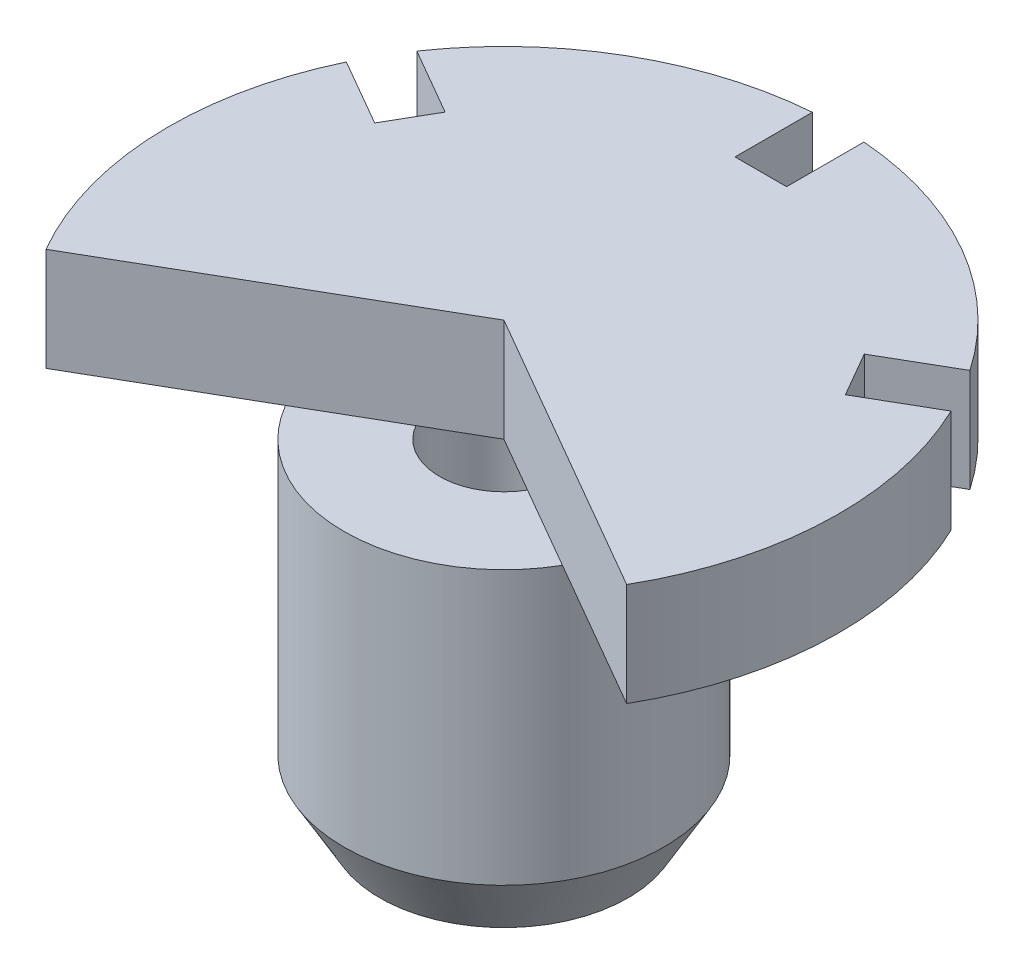
ISO-10303-21;
HEADER;
FILE_DESCRIPTION(('STEP AP214'),'2;1');
FILE_NAME('part.step','',(''),(''),'','','');
FILE_SCHEMA(('AUTOMOTIVE_DESIGN { 1 0 10303 214 1 1 1 1 }'));
ENDSEC;
DATA;
#1=APPLICATION_CONTEXT('core data for automotive mechanical design processes');
#2=APPLICATION_PROTOCOL_DEFINITION('international standard','automotive_design',2000,#1);
#3=PRODUCT_CONTEXT('',#1,'mechanical');
#4=PRODUCT('Part','Part','',(#3));
#5=PRODUCT_RELATED_PRODUCT_CATEGORY('part','',(#4));
#6=PRODUCT_DEFINITION_FORMATION('','',#4);
#7=PRODUCT_DEFINITION_CONTEXT('part definition',#1,'design');
#8=PRODUCT_DEFINITION('design','',#6,#7);
#9=PRODUCT_DEFINITION_SHAPE('','',#8);
#10=(LENGTH_UNIT() NAMED_UNIT(*) SI_UNIT(.MILLI.,.METRE.));
#11=(NAMED_UNIT(*) PLANE_ANGLE_UNIT() SI_UNIT($,.RADIAN.));
#12=(NAMED_UNIT(*) SI_UNIT($,.STERADIAN.) SOLID_ANGLE_UNIT());
#13=UNCERTAINTY_MEASURE_WITH_UNIT(LENGTH_MEASURE(1.E-05),#10,'distance_accuracy_value','');
#14=(GEOMETRIC_REPRESENTATION_CONTEXT(3) GLOBAL_UNCERTAINTY_ASSIGNED_CONTEXT((#13)) GLOBAL_UNIT_ASSIGNED_CONTEXT((#10,
#11,#12)) REPRESENTATION_CONTEXT('',''));
#15=CARTESIAN_POINT('',(0.,0.,0.));
#16=DIRECTION('',(0.,0.,1.));
#17=DIRECTION('',(1.,0.,0.));
#18=AXIS2_PLACEMENT_3D('',#15,#16,#17);
#19=CARTESIAN_POINT('',(0.,20.,0.));
#20=DIRECTION('',(0.499999999999998,0.,-0.86602540378444));
#21=DIRECTION('',(-0.86602540378444,0.,-0.499999999999998));
#22=AXIS2_PLACEMENT_3D('',#19,#20,#21);
#23=PLANE('',#22);
#24=DIRECTION('',(0.86602540378444,0.,0.499999999999998));
#25=VECTOR('',#24,1.);
#26=CARTESIAN_POINT('',(0.,0.,0.));
#27=LINE('',#26,#25);
#28=CARTESIAN_POINT('',(0.,0.,0.));
#29=VERTEX_POINT('',#28);
#30=CARTESIAN_POINT('',(10.8253175473055,0.,6.24999999999997));
#31=VERTEX_POINT('',#30);
#32=EDGE_CURVE('E180',#29,#31,#27,.T.);
#33=ORIENTED_EDGE('',*,*,#32,.T.);
#34=CARTESIAN_POINT('',(26.8467875173176,0.,15.4999999999999));
#35=VERTEX_POINT('',#34);
#36=EDGE_CURVE('E188',#31,#35,#27,.T.);
#37=ORIENTED_EDGE('',*,*,#36,.T.);
#38=CARTESIAN_POINT('',(56.2916512459886,0.,32.4999999999999));
#39=VERTEX_POINT('',#38);
#40=EDGE_CURVE('E194',#35,#39,#27,.T.);
#41=ORIENTED_EDGE('',*,*,#40,.T.);
#42=DIRECTION('',(0.,-1.,0.));
#43=VECTOR('',#42,1.);
#44=CARTESIAN_POINT('',(56.2916512459886,20.,32.4999999999999));
#45=LINE('',#44,#43);
#46=CARTESIAN_POINT('',(56.2916512459886,20.,32.4999999999999));
#47=VERTEX_POINT('',#46);
#48=EDGE_CURVE('E223',#47,#39,#45,.T.);
#49=ORIENTED_EDGE('',*,*,#48,.F.);
#50=DIRECTION('',(0.86602540378444,0.,0.499999999999998));
#51=VECTOR('',#50,1.);
#52=CARTESIAN_POINT('',(0.,20.,0.));
#53=LINE('',#52,#51);
#54=CARTESIAN_POINT('',(0.,20.,0.));
#55=VERTEX_POINT('',#54);
#56=EDGE_CURVE('E624',#55,#47,#53,.T.);
#57=ORIENTED_EDGE('',*,*,#56,.F.);
#58=DIRECTION('',(0.,-1.,0.));
#59=VECTOR('',#58,1.);
#60=CARTESIAN_POINT('',(0.,20.,0.));
#61=LINE('',#60,#59);
#62=EDGE_CURVE('E199',#55,#29,#61,.T.);
#63=ORIENTED_EDGE('',*,*,#62,.T.);
#64=EDGE_LOOP('',(#33,#37,#41,#49,#57,#63));
#65=FACE_BOUND('',#64,.T.);
#66=ADVANCED_FACE('F47',(#65),#23,.F.);
#67=CARTESIAN_POINT('',(0.,20.,0.));
#68=DIRECTION('',(0.,-1.,0.));
#69=DIRECTION('',(0.,0.,-1.));
#70=AXIS2_PLACEMENT_3D('',#67,#68,#69);
#71=CYLINDRICAL_SURFACE('',#70,65.);
#72=CARTESIAN_POINT('',(0.,0.,0.));
#73=DIRECTION('',(0.,1.,0.));
#74=DIRECTION('',(0.,0.,1.));
#75=AXIS2_PLACEMENT_3D('',#72,#73,#74);
#76=CIRCLE('',#75,65.);
#77=CARTESIAN_POINT('',(58.6248608016118,0.,-28.0735764731115));
#78=VERTEX_POINT('',#77);
#79=EDGE_CURVE('E201',#39,#78,#76,.T.);
#80=ORIENTED_EDGE('',*,*,#79,.T.);
#81=DIRECTION('',(0.,-1.,0.));
#82=VECTOR('',#81,1.);
#83=CARTESIAN_POINT('',(58.6248608016118,20.,-28.0735764731115));
#84=LINE('',#83,#82);
#85=CARTESIAN_POINT('',(58.6248608016118,20.,-28.0735764731115));
#86=VERTEX_POINT('',#85);
#87=EDGE_CURVE('E227',#86,#78,#84,.T.);
#88=ORIENTED_EDGE('',*,*,#87,.F.);
#89=CARTESIAN_POINT('',(0.,20.,0.));
#90=DIRECTION('',(0.,1.,0.));
#91=DIRECTION('',(0.,0.,1.));
#92=AXIS2_PLACEMENT_3D('',#89,#90,#91);
#93=CIRCLE('',#92,65.);
#94=EDGE_CURVE('E729',#47,#86,#93,.T.);
#95=ORIENTED_EDGE('',*,*,#94,.F.);
#96=ORIENTED_EDGE('',*,*,#48,.T.);
#97=EDGE_LOOP('',(#80,#88,#95,#96));
#98=FACE_BOUND('',#97,.T.);
#99=ADVANCED_FACE('F256',(#98),#71,.T.);
#100=CARTESIAN_POINT('',(58.6248608016118,20.,-28.0735764731115));
#101=DIRECTION('',(0.499999999999918,0.,0.866025403784486));
#102=DIRECTION('',(0.866025403784486,0.,-0.499999999999918));
#103=AXIS2_PLACEMENT_3D('',#100,#101,#102);
#104=PLANE('',#103);
#105=DIRECTION('',(-0.866025403784486,0.,0.499999999999918));
#106=VECTOR('',#105,1.);
#107=CARTESIAN_POINT('',(58.6248608016118,0.,-28.0735764731115));
#108=LINE('',#107,#106);
#109=CARTESIAN_POINT('',(45.6344797448445,0.,-20.5735764731128));
#110=VERTEX_POINT('',#109);
#111=EDGE_CURVE('E205',#78,#110,#108,.T.);
#112=ORIENTED_EDGE('',*,*,#111,.T.);
#113=DIRECTION('',(0.,-1.,0.));
#114=VECTOR('',#113,1.);
#115=CARTESIAN_POINT('',(45.6344797448445,20.,-20.5735764731128));
#116=LINE('',#115,#114);
#117=CARTESIAN_POINT('',(45.6344797448445,20.,-20.5735764731128));
#118=VERTEX_POINT('',#117);
#119=EDGE_CURVE('E234',#118,#110,#116,.T.);
#120=ORIENTED_EDGE('',*,*,#119,.F.);
#121=DIRECTION('',(-0.866025403784486,0.,0.499999999999918));
#122=VECTOR('',#121,1.);
#123=CARTESIAN_POINT('',(58.6248608016118,20.,-28.0735764731115));
#124=LINE('',#123,#122);
#125=EDGE_CURVE('E730',#86,#118,#124,.T.);
#126=ORIENTED_EDGE('',*,*,#125,.F.);
#127=ORIENTED_EDGE('',*,*,#87,.T.);
#128=EDGE_LOOP('',(#112,#120,#126,#127));
#129=FACE_BOUND('',#128,.T.);
#130=ADVANCED_FACE('F260',(#129),#104,.F.);
#131=CARTESIAN_POINT('',(40.6344797448453,20.,-29.2338305109576));
#132=DIRECTION('',(-0.866025403784486,0.,0.499999999999918));
#133=DIRECTION('',(0.499999999999918,0.,0.866025403784486));
#134=AXIS2_PLACEMENT_3D('',#131,#132,#133);
#135=PLANE('',#134);
#136=DIRECTION('',(-0.499999999999918,0.,-0.866025403784486));
#137=VECTOR('',#136,1.);
#138=CARTESIAN_POINT('',(40.6344797448453,0.,-29.2338305109576));
#139=LINE('',#138,#137);
#140=CARTESIAN_POINT('',(40.6344797448453,0.,-29.2338305109576));
#141=VERTEX_POINT('',#140);
#142=EDGE_CURVE('E674',#110,#141,#139,.T.);
#143=ORIENTED_EDGE('',*,*,#142,.T.);
#144=DIRECTION('',(0.,-1.,0.));
#145=VECTOR('',#144,1.);
#146=CARTESIAN_POINT('',(40.6344797448453,20.,-29.2338305109576));
#147=LINE('',#146,#145);
#148=CARTESIAN_POINT('',(40.6344797448453,20.,-29.2338305109576));
#149=VERTEX_POINT('',#148);
#150=EDGE_CURVE('E666',#149,#141,#147,.T.);
#151=ORIENTED_EDGE('',*,*,#150,.F.);
#152=DIRECTION('',(-0.499999999999918,0.,-0.866025403784486));
#153=VECTOR('',#152,1.);
#154=CARTESIAN_POINT('',(40.6344797448453,20.,-29.2338305109576));
#155=LINE('',#154,#153);
#156=EDGE_CURVE('E675',#118,#149,#155,.T.);
#157=ORIENTED_EDGE('',*,*,#156,.F.);
#158=ORIENTED_EDGE('',*,*,#119,.T.);
#159=EDGE_LOOP('',(#143,#151,#157,#158));
#160=FACE_BOUND('',#159,.T.);
#161=ADVANCED_FACE('F265',(#160),#135,.F.);
#162=CARTESIAN_POINT('',(53.6248608016126,20.,-36.7338305109564));
#163=DIRECTION('',(-0.499999999999918,0.,-0.866025403784486));
#164=DIRECTION('',(-0.866025403784486,0.,0.499999999999918));
#165=AXIS2_PLACEMENT_3D('',#162,#163,#164);
#166=PLANE('',#165);
#167=DIRECTION('',(0.866025403784486,0.,-0.499999999999918));
#168=VECTOR('',#167,1.);
#169=CARTESIAN_POINT('',(53.6248608016126,0.,-36.7338305109564));
#170=LINE('',#169,#168);
#171=CARTESIAN_POINT('',(53.6248608016126,0.,-36.7338305109564));
#172=VERTEX_POINT('',#171);
#173=EDGE_CURVE('E680',#141,#172,#170,.T.);
#174=ORIENTED_EDGE('',*,*,#173,.T.);
#175=DIRECTION('',(0.,-1.,0.));
#176=VECTOR('',#175,1.);
#177=CARTESIAN_POINT('',(53.6248608016126,20.,-36.7338305109564));
#178=LINE('',#177,#176);
#179=CARTESIAN_POINT('',(53.6248608016126,20.,-36.7338305109564));
#180=VERTEX_POINT('',#179);
#181=EDGE_CURVE('E662',#180,#172,#178,.T.);
#182=ORIENTED_EDGE('',*,*,#181,.F.);
#183=DIRECTION('',(0.866025403784486,0.,-0.499999999999918));
#184=VECTOR('',#183,1.);
#185=CARTESIAN_POINT('',(53.6248608016126,20.,-36.7338305109564));
#186=LINE('',#185,#184);
#187=EDGE_CURVE('E736',#149,#180,#186,.T.);
#188=ORIENTED_EDGE('',*,*,#187,.F.);
#189=ORIENTED_EDGE('',*,*,#150,.T.);
#190=EDGE_LOOP('',(#174,#182,#188,#189));
#191=FACE_BOUND('',#190,.T.);
#192=ADVANCED_FACE('F269',(#191),#166,.F.);
#193=CARTESIAN_POINT('',(0.,20.,0.));
#194=DIRECTION('',(0.,-1.,0.));
#195=DIRECTION('',(0.,0.,-1.));
#196=AXIS2_PLACEMENT_3D('',#193,#194,#195);
#197=CYLINDRICAL_SURFACE('',#196,65.);
#198=CARTESIAN_POINT('',(0.,0.,0.));
#199=DIRECTION('',(0.,1.,0.));
#200=DIRECTION('',(0.,0.,1.));
#201=AXIS2_PLACEMENT_3D('',#198,#199,#200);
#202=CIRCLE('',#201,65.);
#203=CARTESIAN_POINT('',(5.,0.,-64.8074069840786));
#204=VERTEX_POINT('',#203);
#205=EDGE_CURVE('E685',#172,#204,#202,.T.);
#206=ORIENTED_EDGE('',*,*,#205,.T.);
#207=DIRECTION('',(0.,-1.,0.));
#208=VECTOR('',#207,1.);
#209=CARTESIAN_POINT('',(5.,20.,-64.8074069840786));
#210=LINE('',#209,#208);
#211=CARTESIAN_POINT('',(5.,20.,-64.8074069840786));
#212=VERTEX_POINT('',#211);
#213=EDGE_CURVE('E658',#212,#204,#210,.T.);
#214=ORIENTED_EDGE('',*,*,#213,.F.);
#215=CARTESIAN_POINT('',(0.,20.,0.));
#216=DIRECTION('',(0.,1.,0.));
#217=DIRECTION('',(0.,0.,1.));
#218=AXIS2_PLACEMENT_3D('',#215,#216,#217);
#219=CIRCLE('',#218,65.);
#220=EDGE_CURVE('E739',#180,#212,#219,.T.);
#221=ORIENTED_EDGE('',*,*,#220,.F.);
#222=ORIENTED_EDGE('',*,*,#181,.T.);
#223=EDGE_LOOP('',(#206,#214,#221,#222));
#224=FACE_BOUND('',#223,.T.);
#225=ADVANCED_FACE('F273',(#224),#197,.T.);
#226=CARTESIAN_POINT('',(5.,20.,-64.8074069840786));
#227=DIRECTION('',(1.,0.,0.));
#228=DIRECTION('',(0.,0.,-1.));
#229=AXIS2_PLACEMENT_3D('',#226,#227,#228);
#230=PLANE('',#229);
#231=DIRECTION('',(0.,0.,1.));
#232=VECTOR('',#231,1.);
#233=CARTESIAN_POINT('',(5.,0.,-64.8074069840786));
#234=LINE('',#233,#232);
#235=CARTESIAN_POINT('',(5.,0.,-49.8074069840786));
#236=VERTEX_POINT('',#235);
#237=EDGE_CURVE('E608',#204,#236,#234,.T.);
#238=ORIENTED_EDGE('',*,*,#237,.T.);
#239=DIRECTION('',(0.,-1.,0.));
#240=VECTOR('',#239,1.);
#241=CARTESIAN_POINT('',(5.,20.,-49.8074069840786));
#242=LINE('',#241,#240);
#243=CARTESIAN_POINT('',(5.,20.,-49.8074069840786));
#244=VERTEX_POINT('',#243);
#245=EDGE_CURVE('E654',#244,#236,#242,.T.);
#246=ORIENTED_EDGE('',*,*,#245,.F.);
#247=DIRECTION('',(0.,0.,1.));
#248=VECTOR('',#247,1.);
#249=CARTESIAN_POINT('',(5.,20.,-64.8074069840786));
#250=LINE('',#249,#248);
#251=EDGE_CURVE('E741',#212,#244,#250,.T.);
#252=ORIENTED_EDGE('',*,*,#251,.F.);
#253=ORIENTED_EDGE('',*,*,#213,.T.);
#254=EDGE_LOOP('',(#238,#246,#252,#253));
#255=FACE_BOUND('',#254,.T.);
#256=ADVANCED_FACE('F277',(#255),#230,.F.);
#257=CARTESIAN_POINT('',(-5.,20.,-49.8074069840786));
#258=DIRECTION('',(0.,0.,1.));
#259=DIRECTION('',(1.,0.,0.));
#260=AXIS2_PLACEMENT_3D('',#257,#258,#259);
#261=PLANE('',#260);
#262=DIRECTION('',(-1.,0.,0.));
#263=VECTOR('',#262,1.);
#264=CARTESIAN_POINT('',(-5.,0.,-49.8074069840786));
#265=LINE('',#264,#263);
#266=CARTESIAN_POINT('',(-5.,0.,-49.8074069840786));
#267=VERTEX_POINT('',#266);
#268=EDGE_CURVE('E599',#236,#267,#265,.T.);
#269=ORIENTED_EDGE('',*,*,#268,.T.);
#270=DIRECTION('',(0.,-1.,0.));
#271=VECTOR('',#270,1.);
#272=CARTESIAN_POINT('',(-5.,20.,-49.8074069840786));
#273=LINE('',#272,#271);
#274=CARTESIAN_POINT('',(-5.,20.,-49.8074069840786));
#275=VERTEX_POINT('',#274);
#276=EDGE_CURVE('E651',#275,#267,#273,.T.);
#277=ORIENTED_EDGE('',*,*,#276,.F.);
#278=DIRECTION('',(-1.,0.,0.));
#279=VECTOR('',#278,1.);
#280=CARTESIAN_POINT('',(-5.,20.,-49.8074069840786));
#281=LINE('',#280,#279);
#282=EDGE_CURVE('E700',#244,#275,#281,.T.);
#283=ORIENTED_EDGE('',*,*,#282,.F.);
#284=ORIENTED_EDGE('',*,*,#245,.T.);
#285=EDGE_LOOP('',(#269,#277,#283,#284));
#286=FACE_BOUND('',#285,.T.);
#287=ADVANCED_FACE('F281',(#286),#261,.F.);
#288=CARTESIAN_POINT('',(-5.,20.,-64.8074069840786));
#289=DIRECTION('',(-1.,0.,0.));
#290=DIRECTION('',(0.,0.,1.));
#291=AXIS2_PLACEMENT_3D('',#288,#289,#290);
#292=PLANE('',#291);
#293=DIRECTION('',(0.,0.,-1.));
#294=VECTOR('',#293,1.);
#295=CARTESIAN_POINT('',(-5.,0.,-64.8074069840786));
#296=LINE('',#295,#294);
#297=CARTESIAN_POINT('',(-4.99999999999998,0.,-64.8074069840786));
#298=VERTEX_POINT('',#297);
#299=EDGE_CURVE('E597',#267,#298,#296,.T.);
#300=ORIENTED_EDGE('',*,*,#299,.T.);
#301=DIRECTION('',(0.,-1.,0.));
#302=VECTOR('',#301,1.);
#303=CARTESIAN_POINT('',(-4.99999999999998,20.,-64.8074069840786));
#304=LINE('',#303,#302);
#305=CARTESIAN_POINT('',(-4.99999999999998,20.,-64.8074069840786));
#306=VERTEX_POINT('',#305);
#307=EDGE_CURVE('E648',#306,#298,#304,.T.);
#308=ORIENTED_EDGE('',*,*,#307,.F.);
#309=DIRECTION('',(0.,0.,-1.));
#310=VECTOR('',#309,1.);
#311=CARTESIAN_POINT('',(-5.,20.,-64.8074069840786));
#312=LINE('',#311,#310);
#313=EDGE_CURVE('E716',#275,#306,#312,.T.);
#314=ORIENTED_EDGE('',*,*,#313,.F.);
#315=ORIENTED_EDGE('',*,*,#276,.T.);
#316=EDGE_LOOP('',(#300,#308,#314,#315));
#317=FACE_BOUND('',#316,.T.);
#318=ADVANCED_FACE('F285',(#317),#292,.F.);
#319=CARTESIAN_POINT('',(0.,20.,0.));
#320=DIRECTION('',(0.,-1.,0.));
#321=DIRECTION('',(0.,0.,-1.));
#322=AXIS2_PLACEMENT_3D('',#319,#320,#321);
#323=CYLINDRICAL_SURFACE('',#322,65.);
#324=CARTESIAN_POINT('',(0.,0.,0.));
#325=DIRECTION('',(0.,1.,0.));
#326=DIRECTION('',(0.,0.,1.));
#327=AXIS2_PLACEMENT_3D('',#324,#325,#326);
#328=CIRCLE('',#327,65.);
#329=CARTESIAN_POINT('',(-53.6248608016091,0.,-36.7338305109615));
#330=VERTEX_POINT('',#329);
#331=EDGE_CURVE('E598',#298,#330,#328,.T.);
#332=ORIENTED_EDGE('',*,*,#331,.T.);
#333=DIRECTION('',(0.,-1.,0.));
#334=VECTOR('',#333,1.);
#335=CARTESIAN_POINT('',(-53.6248608016091,20.,-36.7338305109615));
#336=LINE('',#335,#334);
#337=CARTESIAN_POINT('',(-53.6248608016091,20.,-36.7338305109615));
#338=VERTEX_POINT('',#337);
#339=EDGE_CURVE('E644',#338,#330,#336,.T.);
#340=ORIENTED_EDGE('',*,*,#339,.F.);
#341=CARTESIAN_POINT('',(0.,20.,0.));
#342=DIRECTION('',(0.,1.,0.));
#343=DIRECTION('',(0.,0.,1.));
#344=AXIS2_PLACEMENT_3D('',#341,#342,#343);
#345=CIRCLE('',#344,65.);
#346=EDGE_CURVE('E710',#306,#338,#345,.T.);
#347=ORIENTED_EDGE('',*,*,#346,.F.);
#348=ORIENTED_EDGE('',*,*,#307,.T.);
#349=EDGE_LOOP('',(#332,#340,#347,#348));
#350=FACE_BOUND('',#349,.T.);
#351=ADVANCED_FACE('F289',(#350),#323,.T.);
#352=CARTESIAN_POINT('',(-53.6248608016091,20.,-36.7338305109615));
#353=DIRECTION('',(0.5,0.,-0.866025403784439));
#354=DIRECTION('',(-0.866025403784439,0.,-0.5));
#355=AXIS2_PLACEMENT_3D('',#352,#353,#354);
#356=PLANE('',#355);
#357=DIRECTION('',(0.866025403784439,0.,0.5));
#358=VECTOR('',#357,1.);
#359=CARTESIAN_POINT('',(-53.6248608016091,0.,-36.7338305109615));
#360=LINE('',#359,#358);
#361=CARTESIAN_POINT('',(-40.6344797448425,0.,-29.2338305109615));
#362=VERTEX_POINT('',#361);
#363=EDGE_CURVE('E606',#330,#362,#360,.T.);
#364=ORIENTED_EDGE('',*,*,#363,.T.);
#365=DIRECTION('',(0.,-1.,0.));
#366=VECTOR('',#365,1.);
#367=CARTESIAN_POINT('',(-40.6344797448425,20.,-29.2338305109615));
#368=LINE('',#367,#366);
#369=CARTESIAN_POINT('',(-40.6344797448425,20.,-29.2338305109615));
#370=VERTEX_POINT('',#369);
#371=EDGE_CURVE('E640',#370,#362,#368,.T.);
#372=ORIENTED_EDGE('',*,*,#371,.F.);
#373=DIRECTION('',(0.866025403784439,0.,0.5));
#374=VECTOR('',#373,1.);
#375=CARTESIAN_POINT('',(-53.6248608016091,20.,-36.7338305109615));
#376=LINE('',#375,#374);
#377=EDGE_CURVE('E595',#338,#370,#376,.T.);
#378=ORIENTED_EDGE('',*,*,#377,.F.);
#379=ORIENTED_EDGE('',*,*,#339,.T.);
#380=EDGE_LOOP('',(#364,#372,#378,#379));
#381=FACE_BOUND('',#380,.T.);
#382=ADVANCED_FACE('F293',(#381),#356,.F.);
#383=CARTESIAN_POINT('',(-45.6344797448425,20.,-20.5735764731171));
#384=DIRECTION('',(0.866025403784438,0.,0.5));
#385=DIRECTION('',(0.5,0.,-0.866025403784438));
#386=AXIS2_PLACEMENT_3D('',#383,#384,#385);
#387=PLANE('',#386);
#388=DIRECTION('',(-0.5,0.,0.866025403784438));
#389=VECTOR('',#388,1.);
#390=CARTESIAN_POINT('',(-45.6344797448425,0.,-20.5735764731171));
#391=LINE('',#390,#389);
#392=CARTESIAN_POINT('',(-45.6344797448425,0.,-20.5735764731171));
#393=VERTEX_POINT('',#392);
#394=EDGE_CURVE('E614',#362,#393,#391,.T.);
#395=ORIENTED_EDGE('',*,*,#394,.T.);
#396=DIRECTION('',(0.,-1.,0.));
#397=VECTOR('',#396,1.);
#398=CARTESIAN_POINT('',(-45.6344797448425,20.,-20.5735764731171));
#399=LINE('',#398,#397);
#400=CARTESIAN_POINT('',(-45.6344797448425,20.,-20.5735764731171));
#401=VERTEX_POINT('',#400);
#402=EDGE_CURVE('E636',#401,#393,#399,.T.);
#403=ORIENTED_EDGE('',*,*,#402,.F.);
#404=DIRECTION('',(-0.5,0.,0.866025403784438));
#405=VECTOR('',#404,1.);
#406=CARTESIAN_POINT('',(-45.6344797448425,20.,-20.5735764731171));
#407=LINE('',#406,#405);
#408=EDGE_CURVE('E709',#370,#401,#407,.T.);
#409=ORIENTED_EDGE('',*,*,#408,.F.);
#410=ORIENTED_EDGE('',*,*,#371,.T.);
#411=EDGE_LOOP('',(#395,#403,#409,#410));
#412=FACE_BOUND('',#411,.T.);
#413=ADVANCED_FACE('F297',(#412),#387,.F.);
#414=CARTESIAN_POINT('',(-58.6248608016091,20.,-28.0735764731171));
#415=DIRECTION('',(-0.5,0.,0.866025403784439));
#416=DIRECTION('',(0.866025403784439,0.,0.5));
#417=AXIS2_PLACEMENT_3D('',#414,#415,#416);
#418=PLANE('',#417);
#419=DIRECTION('',(-0.866025403784438,0.,-0.5));
#420=VECTOR('',#419,1.);
#421=CARTESIAN_POINT('',(-58.6248608016091,0.,-28.0735764731171));
#422=LINE('',#421,#420);
#423=CARTESIAN_POINT('',(-58.6248608016091,0.,-28.0735764731171));
#424=VERTEX_POINT('',#423);
#425=EDGE_CURVE('E616',#393,#424,#422,.T.);
#426=ORIENTED_EDGE('',*,*,#425,.T.);
#427=DIRECTION('',(0.,-1.,0.));
#428=VECTOR('',#427,1.);
#429=CARTESIAN_POINT('',(-58.6248608016091,20.,-28.0735764731171));
#430=LINE('',#429,#428);
#431=CARTESIAN_POINT('',(-58.6248608016091,20.,-28.0735764731171));
#432=VERTEX_POINT('',#431);
#433=EDGE_CURVE('E633',#432,#424,#430,.T.);
#434=ORIENTED_EDGE('',*,*,#433,.F.);
#435=DIRECTION('',(-0.866025403784438,0.,-0.5));
#436=VECTOR('',#435,1.);
#437=CARTESIAN_POINT('',(-58.6248608016091,20.,-28.0735764731171));
#438=LINE('',#437,#436);
#439=EDGE_CURVE('E713',#401,#432,#438,.T.);
#440=ORIENTED_EDGE('',*,*,#439,.F.);
#441=ORIENTED_EDGE('',*,*,#402,.T.);
#442=EDGE_LOOP('',(#426,#434,#440,#441));
#443=FACE_BOUND('',#442,.T.);
#444=ADVANCED_FACE('F301',(#443),#418,.F.);
#445=CARTESIAN_POINT('',(0.,20.,0.));
#446=DIRECTION('',(0.,-1.,0.));
#447=DIRECTION('',(0.,0.,-1.));
#448=AXIS2_PLACEMENT_3D('',#445,#446,#447);
#449=CYLINDRICAL_SURFACE('',#448,65.);
#450=CARTESIAN_POINT('',(0.,0.,0.));
#451=DIRECTION('',(0.,1.,0.));
#452=DIRECTION('',(0.,0.,1.));
#453=AXIS2_PLACEMENT_3D('',#450,#451,#452);
#454=CIRCLE('',#453,65.);
#455=CARTESIAN_POINT('',(-56.2916512459886,0.,32.4999999999999));
#456=VERTEX_POINT('',#455);
#457=EDGE_CURVE('E619',#424,#456,#454,.T.);
#458=ORIENTED_EDGE('',*,*,#457,.T.);
#459=DIRECTION('',(0.,-1.,0.));
#460=VECTOR('',#459,1.);
#461=CARTESIAN_POINT('',(-56.2916512459886,20.,32.4999999999999));
#462=LINE('',#461,#460);
#463=CARTESIAN_POINT('',(-56.2916512459886,20.,32.4999999999999));
#464=VERTEX_POINT('',#463);
#465=EDGE_CURVE('E628',#464,#456,#462,.T.);
#466=ORIENTED_EDGE('',*,*,#465,.F.);
#467=CARTESIAN_POINT('',(0.,20.,0.));
#468=DIRECTION('',(0.,1.,0.));
#469=DIRECTION('',(0.,0.,1.));
#470=AXIS2_PLACEMENT_3D('',#467,#468,#469);
#471=CIRCLE('',#470,65.);
#472=EDGE_CURVE('E722',#432,#464,#471,.T.);
#473=ORIENTED_EDGE('',*,*,#472,.F.);
#474=ORIENTED_EDGE('',*,*,#433,.T.);
#475=EDGE_LOOP('',(#458,#466,#473,#474));
#476=FACE_BOUND('',#475,.T.);
#477=ADVANCED_FACE('F305',(#476),#449,.T.);
#478=CARTESIAN_POINT('',(0.,20.,0.));
#479=DIRECTION('',(-0.499999999999998,0.,-0.86602540378444));
#480=DIRECTION('',(-0.86602540378444,0.,0.499999999999998));
#481=AXIS2_PLACEMENT_3D('',#478,#479,#480);
#482=PLANE('',#481);
#483=DIRECTION('',(0.86602540378444,0.,-0.499999999999998));
#484=VECTOR('',#483,1.);
#485=CARTESIAN_POINT('',(0.,0.,0.));
#486=LINE('',#485,#484);
#487=CARTESIAN_POINT('',(-26.8467875173176,0.,15.4999999999999));
#488=VERTEX_POINT('',#487);
#489=EDGE_CURVE('E622',#456,#488,#486,.T.);
#490=ORIENTED_EDGE('',*,*,#489,.T.);
#491=CARTESIAN_POINT('',(-10.8253175473055,0.,6.24999999999997));
#492=VERTEX_POINT('',#491);
#493=EDGE_CURVE('E625',#488,#492,#486,.T.);
#494=ORIENTED_EDGE('',*,*,#493,.T.);
#495=EDGE_CURVE('E182',#492,#29,#486,.T.);
#496=ORIENTED_EDGE('',*,*,#495,.T.);
#497=ORIENTED_EDGE('',*,*,#62,.F.);
#498=DIRECTION('',(0.86602540378444,0.,-0.499999999999998));
#499=VECTOR('',#498,1.);
#500=CARTESIAN_POINT('',(0.,20.,0.));
#501=LINE('',#500,#499);
#502=EDGE_CURVE('E629',#464,#55,#501,.T.);
#503=ORIENTED_EDGE('',*,*,#502,.F.);
#504=ORIENTED_EDGE('',*,*,#465,.T.);
#505=EDGE_LOOP('',(#490,#494,#496,#497,#503,#504));
#506=FACE_BOUND('',#505,.T.);
#507=ADVANCED_FACE('F309',(#506),#482,.F.);
#508=CARTESIAN_POINT('',(0.,20.,0.));
#509=DIRECTION('',(0.,1.,0.));
#510=DIRECTION('',(0.,0.,1.));
#511=AXIS2_PLACEMENT_3D('',#508,#509,#510);
#512=PLANE('',#511);
#513=ORIENTED_EDGE('',*,*,#56,.T.);
#514=ORIENTED_EDGE('',*,*,#94,.T.);
#515=ORIENTED_EDGE('',*,*,#125,.T.);
#516=ORIENTED_EDGE('',*,*,#156,.T.);
#517=ORIENTED_EDGE('',*,*,#187,.T.);
#518=ORIENTED_EDGE('',*,*,#220,.T.);
#519=ORIENTED_EDGE('',*,*,#251,.T.);
#520=ORIENTED_EDGE('',*,*,#282,.T.);
#521=ORIENTED_EDGE('',*,*,#313,.T.);
#522=ORIENTED_EDGE('',*,*,#346,.T.);
#523=ORIENTED_EDGE('',*,*,#377,.T.);
#524=ORIENTED_EDGE('',*,*,#408,.T.);
#525=ORIENTED_EDGE('',*,*,#439,.T.);
#526=ORIENTED_EDGE('',*,*,#472,.T.);
#527=ORIENTED_EDGE('',*,*,#502,.T.);
#528=EDGE_LOOP('',(#513,#514,#515,#516,#517,#518,#519,#520,#521,#522,#523,#524,#525,#526,#527));
#529=FACE_BOUND('',#528,.T.);
#530=ADVANCED_FACE('F313',(#529),#512,.T.);
#531=CARTESIAN_POINT('',(0.,0.,0.));
#532=DIRECTION('',(0.,1.,0.));
#533=DIRECTION('',(0.,0.,1.));
#534=AXIS2_PLACEMENT_3D('',#531,#532,#533);
#535=PLANE('',#534);
#536=CARTESIAN_POINT('',(0.,0.,0.));
#537=DIRECTION('',(0.,-1.,0.));
#538=DIRECTION('',(0.,0.,-1.));
#539=AXIS2_PLACEMENT_3D('',#536,#537,#538);
#540=CIRCLE('',#539,31.);
#541=EDGE_CURVE('E71',#488,#35,#540,.T.);
#542=ORIENTED_EDGE('',*,*,#541,.F.);
#543=ORIENTED_EDGE('',*,*,#489,.F.);
#544=ORIENTED_EDGE('',*,*,#457,.F.);
#545=ORIENTED_EDGE('',*,*,#425,.F.);
#546=ORIENTED_EDGE('',*,*,#394,.F.);
#547=ORIENTED_EDGE('',*,*,#363,.F.);
#548=ORIENTED_EDGE('',*,*,#331,.F.);
#549=ORIENTED_EDGE('',*,*,#299,.F.);
#550=ORIENTED_EDGE('',*,*,#268,.F.);
#551=ORIENTED_EDGE('',*,*,#237,.F.);
#552=ORIENTED_EDGE('',*,*,#205,.F.);
#553=ORIENTED_EDGE('',*,*,#173,.F.);
#554=ORIENTED_EDGE('',*,*,#142,.F.);
#555=ORIENTED_EDGE('',*,*,#111,.F.);
#556=ORIENTED_EDGE('',*,*,#79,.F.);
#557=ORIENTED_EDGE('',*,*,#40,.F.);
#558=EDGE_LOOP('',(#542,#543,#544,#545,#546,#547,#548,#549,#550,#551,#552,#553,#554,#555,#556,#557));
#559=FACE_BOUND('',#558,.T.);
#560=ADVANCED_FACE('F315',(#559),#535,.F.);
#561=CARTESIAN_POINT('',(0.,-65.,0.));
#562=DIRECTION('',(0.,1.,0.));
#563=DIRECTION('',(0.,0.,1.));
#564=AXIS2_PLACEMENT_3D('',#561,#562,#563);
#565=CYLINDRICAL_SURFACE('',#564,31.);
#566=CARTESIAN_POINT('',(0.,-52.9999999999999,0.));
#567=DIRECTION('',(0.,-1.,0.));
#568=DIRECTION('',(0.,0.,-1.));
#569=AXIS2_PLACEMENT_3D('',#566,#567,#568);
#570=CIRCLE('',#569,31.);
#571=CARTESIAN_POINT('',(0.,-52.9999999999999,-31.));
#572=VERTEX_POINT('',#571);
#573=EDGE_CURVE('E11',#572,#572,#570,.F.);
#574=ORIENTED_EDGE('',*,*,#573,.T.);
#575=EDGE_LOOP('',(#574));
#576=FACE_BOUND('',#575,.T.);
#577=CARTESIAN_POINT('',(-2.99999999999999,-13.,-30.854497241083));
#578=CARTESIAN_POINT('',(-2.99999270546674,-13.1680874601518,-30.8544991521725));
#579=CARTESIAN_POINT('',(-2.9858257362219,-13.3362867441366,-30.8558855863577));
#580=CARTESIAN_POINT('',(-2.92952380686578,-13.6680239065468,-30.8612809049321));
#581=CARTESIAN_POINT('',(-2.88735784450409,-13.8315564080365,-30.865292696211));
#582=CARTESIAN_POINT('',(-2.77629551338685,-14.1491077898903,-30.8754801420287));
#583=CARTESIAN_POINT('',(-2.70741513143378,-14.303132296376,-30.8816545022002));
#584=CARTESIAN_POINT('',(-2.54490947032602,-14.5973997714778,-30.8954697938875));
#585=CARTESIAN_POINT('',(-2.45128918359277,-14.7376455127737,-30.9031104294291));
#586=CARTESIAN_POINT('',(-2.24161750202098,-15.000887232793,-30.9190265988605));
#587=CARTESIAN_POINT('',(-2.12549890017329,-15.1238295741418,-30.9273039890436));
#588=CARTESIAN_POINT('',(-1.87427013784986,-15.348512948809,-30.9435441356075));
#589=CARTESIAN_POINT('',(-1.73915911715036,-15.4502530212946,-30.951506877716));
#590=CARTESIAN_POINT('',(-1.4534538051039,-15.6298279655123,-30.9662387424546));
#591=CARTESIAN_POINT('',(-1.30282966496118,-15.7076155586795,-30.9730054933113));
#592=CARTESIAN_POINT('',(-0.990581210904555,-15.836774989842,-30.9845627817704));
#593=CARTESIAN_POINT('',(-0.828957149487637,-15.8881474339508,-30.989353364717));
#594=CARTESIAN_POINT('',(-0.499837288522849,-15.962861506886,-30.9964055295587));
#595=CARTESIAN_POINT('',(-0.332361606707494,-15.986290995589,-30.9986750368159));
#596=CARTESIAN_POINT('',(0.00415929437878383,-16.0047258832258,-31.0004562735711));
#597=CARTESIAN_POINT('',(0.173204475240595,-15.999731975922,-30.9999680703797));
#598=CARTESIAN_POINT('',(0.507469510720821,-15.9615332617784,-30.9962953909801));
#599=CARTESIAN_POINT('',(0.672700274889472,-15.9284229316785,-30.9931199445631));
#600=CARTESIAN_POINT('',(0.995248364648452,-15.8350783770651,-30.9844400859807));
#601=CARTESIAN_POINT('',(1.15256559303607,-15.7748438194726,-30.9789356452159));
#602=CARTESIAN_POINT('',(1.45511934340038,-15.6288567043269,-30.9662012052369));
#603=CARTESIAN_POINT('',(1.60033551816717,-15.5430622347018,-30.9589683757684));
#604=CARTESIAN_POINT('',(1.87434297205694,-15.3484211179904,-30.9435889979261));
#605=CARTESIAN_POINT('',(2.00313380010904,-15.2395738380491,-30.9354424244707));
#606=CARTESIAN_POINT('',(2.24118782391023,-15.0013853009046,-30.9191106372075));
#607=CARTESIAN_POINT('',(2.35036882151944,-14.8719618768066,-30.9109254018771));
#608=CARTESIAN_POINT('',(2.54546783855885,-14.5965800932197,-30.8954721911231));
#609=CARTESIAN_POINT('',(2.63138582765469,-14.45062171217,-30.8882042168957));
#610=CARTESIAN_POINT('',(2.77751896711129,-14.1462511999649,-30.8754076345162));
#611=CARTESIAN_POINT('',(2.83772920822286,-13.9878366969745,-30.8698793586364));
#612=CARTESIAN_POINT('',(2.93067352671388,-13.6630811954964,-30.8611949065408));
#613=CARTESIAN_POINT('',(2.96340838698393,-13.4967404230047,-30.8580386627359));
#614=CARTESIAN_POINT('',(3.00036733454544,-13.1615753119516,-30.854467193814));
#615=CARTESIAN_POINT('',(3.00470634038823,-12.9927637584545,-30.8540409206054));
#616=CARTESIAN_POINT('',(2.98505205106242,-12.6568159052907,-30.8559485014023));
#617=CARTESIAN_POINT('',(2.96105911400283,-12.4896795844764,-30.8582823205208));
#618=CARTESIAN_POINT('',(2.885518085988,-12.1621605034909,-30.8654370676959));
#619=CARTESIAN_POINT('',(2.83402418597875,-12.0017651284145,-30.8702531038671));
#620=CARTESIAN_POINT('',(2.7049982301162,-11.6918891312282,-30.8818256523098));
#621=CARTESIAN_POINT('',(2.62746561459911,-11.542408743804,-30.8885822062894));
#622=CARTESIAN_POINT('',(2.44827460847684,-11.2580816882879,-30.9033012499967));
#623=CARTESIAN_POINT('',(2.34653997742094,-11.1232832678806,-30.9112675212603));
#624=CARTESIAN_POINT('',(2.12194226148829,-10.872635504096,-30.9274959406585));
#625=CARTESIAN_POINT('',(1.99907868677551,-10.7567866001502,-30.935758095649));
#626=CARTESIAN_POINT('',(1.7352125891704,-10.5469309361022,-30.9516806026682));
#627=CARTESIAN_POINT('',(1.59415034752777,-10.4529990812098,-30.9593388333261));
#628=CARTESIAN_POINT('',(1.29818666150387,-10.2901590316669,-30.9731597973319));
#629=CARTESIAN_POINT('',(1.14328539627633,-10.2212505131341,-30.9793225500357));
#630=CARTESIAN_POINT('',(0.824303651715355,-10.110540473313,-30.989448564794));
#631=CARTESIAN_POINT('',(0.660239073999921,-10.0686934866681,-30.9934155143345));
#632=CARTESIAN_POINT('',(0.327372052353002,-10.0131459660679,-30.9987180532818));
#633=CARTESIAN_POINT('',(0.15856973264887,-9.99944469480717,-31.000053711618));
#634=CARTESIAN_POINT('',(-0.178244815397772,-10.0005875254659,-30.9999431701879));
#635=CARTESIAN_POINT('',(-0.346257454486081,-10.0153152513039,-30.9985083117184));
#636=CARTESIAN_POINT('',(-0.677410197389665,-10.0726542566819,-30.9930403424306));
#637=CARTESIAN_POINT('',(-0.840550296732827,-10.1152655618131,-30.9890072292278));
#638=CARTESIAN_POINT('',(-1.15732782289443,-10.2271304383273,-30.9787947570799));
#639=CARTESIAN_POINT('',(-1.31096636777667,-10.2963808680894,-30.9726156512257));
#640=CARTESIAN_POINT('',(-1.60445703218018,-10.4595456771453,-30.958800499318));
#641=CARTESIAN_POINT('',(-1.74430926063482,-10.5534598615355,-30.9511644647779));
#642=CARTESIAN_POINT('',(-2.00685374664979,-10.7637229806045,-30.935253888567));
#643=CARTESIAN_POINT('',(-2.12947651756276,-10.8801585002125,-30.9269769590512));
#644=CARTESIAN_POINT('',(-2.35349629489231,-11.1319906045665,-30.9107377042722));
#645=CARTESIAN_POINT('',(-2.45488819134341,-11.2673917410055,-30.9027754551214));
#646=CARTESIAN_POINT('',(-2.63375747675242,-11.5536641763632,-30.8880465610873));
#647=CARTESIAN_POINT('',(-2.71117685026175,-11.7045718459981,-30.8812828333681));
#648=CARTESIAN_POINT('',(-2.83947487995129,-12.0172127392938,-30.8697516965557));
#649=CARTESIAN_POINT('',(-2.89038359258056,-12.1789334677939,-30.8649820279146));
#650=CARTESIAN_POINT('',(-2.95146369481047,-12.4513150288213,-30.8591868564051));
#651=CARTESIAN_POINT('',(-2.96964007666641,-12.5602322095025,-30.8574365186721));
#652=CARTESIAN_POINT('',(-2.99391059960416,-12.7794168750338,-30.855091086121));
#653=CARTESIAN_POINT('',(-3.00000478739545,-12.889684354662,-30.8544959868367));
#654=CARTESIAN_POINT('',(-2.99999999999999,-13.,-30.854497241083));
#655=B_SPLINE_CURVE_WITH_KNOTS('',3,(#577,#578,#579,#580,#581,#582,#583,#584,#585,#586,#587,
#588,#589,#590,#591,#592,#593,#594,#595,#596,#597,#598,#599,#600,#601,#602,#603,#604,#605,#606,
#607,#608,#609,#610,#611,#612,#613,#614,#615,#616,#617,#618,#619,#620,#621,#622,#623,#624,#625,
#626,#627,#628,#629,#630,#631,#632,#633,#634,#635,#636,#637,#638,#639,#640,#641,#642,#643,#644,
#645,#646,#647,#648,#649,#650,#651,#652,#653,#654),.UNSPECIFIED.,.T.,.F.,(4,2,2,2,2,2,2,2,2,2,2,
2,2,2,2,2,2,2,2,2,2,2,2,2,2,2,2,2,2,2,2,2,2,2,2,2,2,2,4),(0.,0.503859541955878,1.0082779213577,
1.51239490454059,2.01641023635857,2.52195504615689,3.02752276098221,3.53408208594286,
4.04062978703925,4.54558053647042,5.05051896104185,5.55376737609712,6.05702197109174,
6.56110636692265,7.0652046028785,7.57136890379556,8.07753386473449,8.583795441672,
9.09004259257136,9.59423967811994,10.0984303908056,10.6016312362507,11.104842897948,
11.6096612573083,12.1144913215397,12.6210222502714,13.1275466226334,13.6332177707056,
14.1388756720433,14.6424680165496,15.1460608232488,15.6495942581429,16.1531237140196,
16.6586289507612,17.1642557158317,17.6710967438116,18.177361883048,18.5080457149449,
18.8387282684228),.UNSPECIFIED.);
#656=CARTESIAN_POINT('',(-2.99999999999999,-13.,-30.854497241083));
#657=VERTEX_POINT('',#656);
#658=EDGE_CURVE('E328',#657,#657,#655,.T.);
#659=ORIENTED_EDGE('',*,*,#658,.T.);
#660=EDGE_LOOP('',(#659));
#661=FACE_BOUND('',#660,.T.);
#662=EDGE_CURVE('E191',#35,#488,#540,.T.);
#663=ORIENTED_EDGE('',*,*,#662,.T.);
#664=ORIENTED_EDGE('',*,*,#541,.T.);
#665=EDGE_LOOP('',(#663,#664));
#666=FACE_BOUND('',#665,.T.);
#667=ADVANCED_FACE('F318',(#576,#661,#666),#565,.T.);
#668=CARTESIAN_POINT('',(0.,-65.,0.));
#669=DIRECTION('',(0.,-1.,0.));
#670=DIRECTION('',(0.,0.,-1.));
#671=AXIS2_PLACEMENT_3D('',#668,#669,#670);
#672=PLANE('',#671);
#673=CARTESIAN_POINT('',(0.,-65.,0.));
#674=DIRECTION('',(0.,-1.,0.));
#675=DIRECTION('',(0.,0.,-1.));
#676=AXIS2_PLACEMENT_3D('',#673,#674,#675);
#677=CIRCLE('',#676,24.0717967697245);
#678=CARTESIAN_POINT('',(0.,-65.,-24.0717967697245));
#679=VERTEX_POINT('',#678);
#680=EDGE_CURVE('E57',#679,#679,#677,.T.);
#681=ORIENTED_EDGE('',*,*,#680,.T.);
#682=EDGE_LOOP('',(#681));
#683=FACE_BOUND('',#682,.T.);
#684=CARTESIAN_POINT('',(0.,-65.,0.));
#685=DIRECTION('',(0.,-1.,0.));
#686=DIRECTION('',(0.,0.,-1.));
#687=AXIS2_PLACEMENT_3D('',#684,#685,#686);
#688=CIRCLE('',#687,20.);
#689=CARTESIAN_POINT('',(0.,-65.,-20.));
#690=VERTEX_POINT('',#689);
#691=EDGE_CURVE('E184',#690,#690,#688,.T.);
#692=ORIENTED_EDGE('',*,*,#691,.F.);
#693=EDGE_LOOP('',(#692));
#694=FACE_BOUND('',#693,.T.);
#695=ADVANCED_FACE('F243',(#683,#694),#672,.T.);
#696=CARTESIAN_POINT('',(0.,0.,0.));
#697=DIRECTION('',(0.,-1.,0.));
#698=DIRECTION('',(0.,0.,-1.));
#699=AXIS2_PLACEMENT_3D('',#696,#697,#698);
#700=PLANE('',#699);
#701=ORIENTED_EDGE('',*,*,#36,.F.);
#702=CARTESIAN_POINT('',(0.,0.,0.));
#703=DIRECTION('',(0.,-1.,0.));
#704=DIRECTION('',(0.,0.,-1.));
#705=AXIS2_PLACEMENT_3D('',#702,#703,#704);
#706=CIRCLE('',#705,12.5);
#707=EDGE_CURVE('E168',#31,#492,#706,.T.);
#708=ORIENTED_EDGE('',*,*,#707,.T.);
#709=ORIENTED_EDGE('',*,*,#493,.F.);
#710=ORIENTED_EDGE('',*,*,#662,.F.);
#711=EDGE_LOOP('',(#701,#708,#709,#710));
#712=FACE_BOUND('',#711,.T.);
#713=ADVANCED_FACE('F189',(#712),#700,.F.);
#714=CARTESIAN_POINT('',(0.,-39.,0.));
#715=DIRECTION('',(0.,-1.,0.));
#716=DIRECTION('',(0.,0.,-1.));
#717=AXIS2_PLACEMENT_3D('',#714,#715,#716);
#718=CYLINDRICAL_SURFACE('',#717,20.);
#719=CARTESIAN_POINT('',(0.,-39.,0.));
#720=DIRECTION('',(0.,-1.,0.));
#721=DIRECTION('',(0.,0.,-1.));
#722=AXIS2_PLACEMENT_3D('',#719,#720,#721);
#723=CIRCLE('',#722,20.);
#724=CARTESIAN_POINT('',(0.,-39.,-20.));
#725=VERTEX_POINT('',#724);
#726=EDGE_CURVE('E214',#725,#725,#723,.T.);
#727=CARTESIAN_POINT('',(0.,-39.,-20.));
#728=CARTESIAN_POINT('',(0.,-39.2708333333333,-20.));
#729=CARTESIAN_POINT('',(0.,-39.5416666666667,-20.));
#730=CARTESIAN_POINT('',(0.,-40.0833333333333,-20.));
#731=CARTESIAN_POINT('',(0.,-40.3541666666667,-20.));
#732=CARTESIAN_POINT('',(0.,-40.8958333333333,-20.));
#733=CARTESIAN_POINT('',(0.,-41.1666666666667,-20.));
#734=CARTESIAN_POINT('',(0.,-41.7083333333333,-20.));
#735=CARTESIAN_POINT('',(0.,-41.9791666666667,-20.));
#736=CARTESIAN_POINT('',(0.,-42.5208333333333,-20.));
#737=CARTESIAN_POINT('',(0.,-42.7916666666667,-20.));
#738=CARTESIAN_POINT('',(0.,-43.3333333333333,-20.));
#739=CARTESIAN_POINT('',(0.,-43.6041666666667,-20.));
#740=CARTESIAN_POINT('',(0.,-44.1458333333333,-20.));
#741=CARTESIAN_POINT('',(0.,-44.4166666666667,-20.));
#742=CARTESIAN_POINT('',(0.,-44.9583333333333,-20.));
#743=CARTESIAN_POINT('',(0.,-45.2291666666667,-20.));
#744=CARTESIAN_POINT('',(0.,-45.7708333333333,-20.));
#745=CARTESIAN_POINT('',(0.,-46.0416666666667,-20.));
#746=CARTESIAN_POINT('',(0.,-46.5833333333333,-20.));
#747=CARTESIAN_POINT('',(0.,-46.8541666666667,-20.));
#748=CARTESIAN_POINT('',(0.,-47.3958333333333,-20.));
#749=CARTESIAN_POINT('',(0.,-47.6666666666667,-20.));
#750=CARTESIAN_POINT('',(0.,-48.2083333333333,-20.));
#751=CARTESIAN_POINT('',(0.,-48.4791666666667,-20.));
#752=CARTESIAN_POINT('',(0.,-49.0208333333333,-20.));
#753=CARTESIAN_POINT('',(0.,-49.2916666666667,-20.));
#754=CARTESIAN_POINT('',(0.,-49.8333333333333,-20.));
#755=CARTESIAN_POINT('',(0.,-50.1041666666667,-20.));
#756=CARTESIAN_POINT('',(0.,-50.6458333333333,-20.));
#757=CARTESIAN_POINT('',(0.,-50.9166666666667,-20.));
#758=CARTESIAN_POINT('',(0.,-51.4583333333333,-20.));
#759=CARTESIAN_POINT('',(0.,-51.7291666666667,-20.));
#760=CARTESIAN_POINT('',(0.,-52.2708333333333,-20.));
#761=CARTESIAN_POINT('',(0.,-52.5416666666667,-20.));
#762=CARTESIAN_POINT('',(0.,-53.0833333333333,-20.));
#763=CARTESIAN_POINT('',(0.,-53.3541666666667,-20.));
#764=CARTESIAN_POINT('',(0.,-53.8958333333333,-20.));
#765=CARTESIAN_POINT('',(0.,-54.1666666666667,-20.));
#766=CARTESIAN_POINT('',(0.,-54.7083333333333,-20.));
#767=CARTESIAN_POINT('',(0.,-54.9791666666667,-20.));
#768=CARTESIAN_POINT('',(0.,-55.5208333333333,-20.));
#769=CARTESIAN_POINT('',(0.,-55.7916666666667,-20.));
#770=CARTESIAN_POINT('',(0.,-56.3333333333333,-20.));
#771=CARTESIAN_POINT('',(0.,-56.6041666666667,-20.));
#772=CARTESIAN_POINT('',(0.,-57.1458333333333,-20.));
#773=CARTESIAN_POINT('',(0.,-57.4166666666667,-20.));
#774=CARTESIAN_POINT('',(0.,-57.9583333333333,-20.));
#775=CARTESIAN_POINT('',(0.,-58.2291666666667,-20.));
#776=CARTESIAN_POINT('',(0.,-58.7708333333333,-20.));
#777=CARTESIAN_POINT('',(0.,-59.0416666666667,-20.));
#778=CARTESIAN_POINT('',(0.,-59.5833333333333,-20.));
#779=CARTESIAN_POINT('',(0.,-59.8541666666667,-20.));
#780=CARTESIAN_POINT('',(0.,-60.3958333333333,-20.));
#781=CARTESIAN_POINT('',(0.,-60.6666666666667,-20.));
#782=CARTESIAN_POINT('',(0.,-61.2083333333333,-20.));
#783=CARTESIAN_POINT('',(0.,-61.4791666666667,-20.));
#784=CARTESIAN_POINT('',(0.,-62.0208333333333,-20.));
#785=CARTESIAN_POINT('',(0.,-62.2916666666667,-20.));
#786=CARTESIAN_POINT('',(0.,-62.8333333333333,-20.));
#787=CARTESIAN_POINT('',(0.,-63.1041666666667,-20.));
#788=CARTESIAN_POINT('',(0.,-63.6458333333333,-20.));
#789=CARTESIAN_POINT('',(0.,-63.9166666666667,-20.));
#790=CARTESIAN_POINT('',(0.,-64.4583333333333,-20.));
#791=CARTESIAN_POINT('',(0.,-64.7291666666667,-20.));
#792=CARTESIAN_POINT('',(0.,-65.,-20.));
#793=B_SPLINE_CURVE_WITH_KNOTS('',3,(#727,#728,#729,#730,#731,#732,#733,#734,#735,#736,#737,
#738,#739,#740,#741,#742,#743,#744,#745,#746,#747,#748,#749,#750,#751,#752,#753,#754,#755,#756,
#757,#758,#759,#760,#761,#762,#763,#764,#765,#766,#767,#768,#769,#770,#771,#772,#773,#774,#775,
#776,#777,#778,#779,#780,#781,#782,#783,#784,#785,#786,#787,#788,#789,#790,#791,#792),
.UNSPECIFIED.,.F.,.F.,(4,2,2,2,2,2,2,2,2,2,2,2,2,2,2,2,2,2,2,2,2,2,2,2,2,2,2,2,2,2,2,2,4),(0.,
0.812499999999994,1.62499999999999,2.4375,3.25,4.0625,4.87499999999999,5.68749999999999,
6.49999999999999,7.31249999999999,8.12499999999999,8.93749999999999,9.74999999999999,10.5625,
11.375,12.1875,13.,13.8125,14.625,15.4375,16.25,17.0625,17.875,18.6875,19.5,20.3125,21.125,
21.9375,22.75,23.5625,24.375,25.1875,26.),.UNSPECIFIED.);
#794=EDGE_CURVE('BSEAM353',#725,#690,#793,.T.);
#795=ORIENTED_EDGE('',*,*,#726,.F.);
#796=ORIENTED_EDGE('',*,*,#691,.T.);
#797=ORIENTED_EDGE('',*,*,#794,.T.);
#798=ORIENTED_EDGE('',*,*,#794,.F.);
#799=EDGE_LOOP('',(#795,#797,#796,#798));
#800=FACE_BOUND('',#799,.T.);
#801=ADVANCED_FACE('F353',(#800),#718,.F.);
#802=CARTESIAN_POINT('',(0.,-39.,0.));
#803=DIRECTION('',(0.,-1.,0.));
#804=DIRECTION('',(0.,0.,-1.));
#805=AXIS2_PLACEMENT_3D('',#802,#803,#804);
#806=PLANE('',#805);
#807=CARTESIAN_POINT('',(0.,-39.,0.));
#808=DIRECTION('',(0.,-1.,0.));
#809=DIRECTION('',(0.,0.,-1.));
#810=AXIS2_PLACEMENT_3D('',#807,#808,#809);
#811=CIRCLE('',#810,12.5);
#812=CARTESIAN_POINT('',(0.,-39.,-12.5));
#813=VERTEX_POINT('',#812);
#814=EDGE_CURVE('E185',#813,#813,#811,.T.);
#815=ORIENTED_EDGE('',*,*,#814,.F.);
#816=EDGE_LOOP('',(#815));
#817=FACE_BOUND('',#816,.T.);
#818=ORIENTED_EDGE('',*,*,#726,.T.);
#819=EDGE_LOOP('',(#818));
#820=FACE_BOUND('',#819,.T.);
#821=ADVANCED_FACE('F349',(#817,#820),#806,.T.);
#822=CARTESIAN_POINT('',(0.,-39.,0.));
#823=DIRECTION('',(0.,-1.,0.));
#824=DIRECTION('',(0.,0.,-1.));
#825=AXIS2_PLACEMENT_3D('',#822,#823,#824);
#826=CYLINDRICAL_SURFACE('',#825,12.5);
#827=CARTESIAN_POINT('',(0.,-10.,-12.5));
#828=CARTESIAN_POINT('',(0.165963929028716,-10.0000050240773,-12.4999970714968));
#829=CARTESIAN_POINT('',(0.331985420928067,-10.0138184102361,-12.4966615634859));
#830=CARTESIAN_POINT('',(0.659284290971379,-10.0686327395954,-12.4836783946932));
#831=CARTESIAN_POINT('',(0.820558683214273,-10.1096504279947,-12.4740268462166));
#832=CARTESIAN_POINT('',(1.13358839471402,-10.2174923345044,-12.4494823208195));
#833=CARTESIAN_POINT('',(1.28535442324822,-10.2842868898576,-12.4345953702841));
#834=CARTESIAN_POINT('',(1.57552517879763,-10.4416854364459,-12.4011725442513));
#835=CARTESIAN_POINT('',(1.71392971475166,-10.5322897680773,-12.3826366165873));
#836=CARTESIAN_POINT('',(1.97609263393972,-10.7365641783755,-12.3435386014785));
#837=CARTESIAN_POINT('',(2.0995595210048,-10.8506027810493,-12.322947245431));
#838=CARTESIAN_POINT('',(2.32581080811942,-11.0977188690647,-12.2822574370147));
#839=CARTESIAN_POINT('',(2.42859304624489,-11.230798342041,-12.2621590363612));
#840=CARTESIAN_POINT('',(2.61189993555014,-11.5144458330175,-12.224437969062));
#841=CARTESIAN_POINT('',(2.69210377047564,-11.6652265837589,-12.2068525815312));
#842=CARTESIAN_POINT('',(2.82591582947332,-11.9786198351285,-12.1765733412448));
#843=CARTESIAN_POINT('',(2.87952794169563,-12.1412306020232,-12.1638787734309));
#844=CARTESIAN_POINT('',(2.95765058108663,-12.4704765732689,-12.1451184675007));
#845=CARTESIAN_POINT('',(2.98268262400616,-12.6369811215255,-12.1389341034343));
#846=CARTESIAN_POINT('',(3.00455808879086,-12.9719323796428,-12.1335389605945));
#847=CARTESIAN_POINT('',(3.00140571682399,-13.1403787959569,-12.1343271412568));
#848=CARTESIAN_POINT('',(2.96741912081941,-13.4704759660129,-12.1426811387007));
#849=CARTESIAN_POINT('',(2.93720103400494,-13.6321945651896,-12.1500960921292));
#850=CARTESIAN_POINT('',(2.85092141637188,-13.9481973166478,-12.1706283738785));
#851=CARTESIAN_POINT('',(2.79485817372026,-14.1024809757344,-12.1837460799133));
#852=CARTESIAN_POINT('',(2.65794121231781,-14.4009129780844,-12.2143476734445));
#853=CARTESIAN_POINT('',(2.5768594824696,-14.5449524529167,-12.2318714325758));
#854=CARTESIAN_POINT('',(2.39236688956382,-14.8176045007226,-12.2692875046196));
#855=CARTESIAN_POINT('',(2.28895240342647,-14.9462145652851,-12.2891802016137));
#856=CARTESIAN_POINT('',(2.05951493908846,-15.1878935703187,-12.329732025739));
#857=CARTESIAN_POINT('',(1.93297064389908,-15.3004670990622,-12.3503975788014));
#858=CARTESIAN_POINT('',(1.66255592459691,-15.5028847197464,-12.3896951594929));
#859=CARTESIAN_POINT('',(1.5186850498214,-15.5927282202926,-12.4083271342048));
#860=CARTESIAN_POINT('',(1.2170284771858,-15.7472972206128,-12.4415394956921));
#861=CARTESIAN_POINT('',(1.05920278696054,-15.8119474562378,-12.4561077058019));
#862=CARTESIAN_POINT('',(0.734497606078672,-15.9136650790486,-12.4794620474154));
#863=CARTESIAN_POINT('',(0.567619713387659,-15.9507373176268,-12.4882491958651));
#864=CARTESIAN_POINT('',(0.233787399651662,-15.995502064652,-12.4989027542708));
#865=CARTESIAN_POINT('',(0.0669284805450058,-16.0038698924616,-12.5009282130753));
#866=CARTESIAN_POINT('',(-0.26580438158663,-15.9928332331491,-12.4982807419474));
#867=CARTESIAN_POINT('',(-0.431678404764953,-15.9734310380128,-12.4936083648176));
#868=CARTESIAN_POINT('',(-0.755422580108846,-15.9079630214836,-12.4781916395217));
#869=CARTESIAN_POINT('',(-0.913370579311302,-15.8622608904262,-12.4675301590363));
#870=CARTESIAN_POINT('',(-1.21935330013476,-15.7459018083047,-12.4413335015664));
#871=CARTESIAN_POINT('',(-1.3673870666415,-15.6752424570219,-12.4257978558334));
#872=CARTESIAN_POINT('',(-1.6520615099557,-15.5096334064021,-12.3911910149582));
#873=CARTESIAN_POINT('',(-1.78847176740355,-15.4142992830756,-12.3720653178033));
#874=CARTESIAN_POINT('',(-2.04359904096632,-15.2025430709866,-12.3324936406987));
#875=CARTESIAN_POINT('',(-2.16231325074336,-15.0861176439192,-12.3120474520734));
#876=CARTESIAN_POINT('',(-2.38142453789941,-14.8323591687914,-12.271574214277));
#877=CARTESIAN_POINT('',(-2.48134974047369,-14.6946148779179,-12.2515669262668));
#878=CARTESIAN_POINT('',(-2.65666020824081,-14.4039095721033,-12.2147538797452));
#879=CARTESIAN_POINT('',(-2.73204657223349,-14.2509492389065,-12.1979479778962));
#880=CARTESIAN_POINT('',(-2.85558993518171,-13.934987486456,-12.1696189519335));
#881=CARTESIAN_POINT('',(-2.90390754385904,-13.7720517965788,-12.1580647463107));
#882=CARTESIAN_POINT('',(-2.97238380283978,-13.4400538149793,-12.1415072663683));
#883=CARTESIAN_POINT('',(-2.9925480427499,-13.2709927462382,-12.1365026916888));
#884=CARTESIAN_POINT('',(-3.00387066449353,-12.9363292997194,-12.1337046220624));
#885=CARTESIAN_POINT('',(-2.99578106592265,-12.7707535036733,-12.1357241633848));
#886=CARTESIAN_POINT('',(-2.95253345626267,-12.4434002357763,-12.1463176460425));
#887=CARTESIAN_POINT('',(-2.91737590900096,-12.2816226988887,-12.1548914750658));
#888=CARTESIAN_POINT('',(-2.82138591303537,-11.9672024474518,-12.1775274976747));
#889=CARTESIAN_POINT('',(-2.76068402045611,-11.8145177274163,-12.191561756094));
#890=CARTESIAN_POINT('',(-2.61543373580582,-11.5213955861163,-12.2235433612686));
#891=CARTESIAN_POINT('',(-2.53088229934854,-11.3809597314137,-12.2414912075257));
#892=CARTESIAN_POINT('',(-2.33793007708463,-11.1126629998805,-12.279819325529));
#893=CARTESIAN_POINT('',(-2.22900267979018,-10.9851876769013,-12.3002478697532));
#894=CARTESIAN_POINT('',(-1.99143074773236,-10.7500800119481,-12.3409359831145));
#895=CARTESIAN_POINT('',(-1.86278158874234,-10.6424523367898,-12.361195511444));
#896=CARTESIAN_POINT('',(-1.5868829988014,-10.4483907404453,-12.3996570299581));
#897=CARTESIAN_POINT('',(-1.43936414359401,-10.362331594558,-12.4178200201219));
#898=CARTESIAN_POINT('',(-1.13153622828567,-10.2163704672521,-12.4496380610582));
#899=CARTESIAN_POINT('',(-0.971236973691218,-10.1564486566084,-12.4632965272855));
#900=CARTESIAN_POINT('',(-0.675887025694764,-10.0739613748622,-12.4824059901497));
#901=CARTESIAN_POINT('',(-0.542312066268421,-10.0462833842143,-12.4889599449579));
#902=CARTESIAN_POINT('',(-0.272504227478249,-10.0093012191481,-12.4977580149525));
#903=CARTESIAN_POINT('',(-0.136271517915777,-9.99999587477449,-12.5000024045682));
#904=CARTESIAN_POINT('',(0.,-10.,-12.5));
#905=B_SPLINE_CURVE_WITH_KNOTS('',3,(#827,#828,#829,#830,#831,#832,#833,#834,#835,#836,#837,
#838,#839,#840,#841,#842,#843,#844,#845,#846,#847,#848,#849,#850,#851,#852,#853,#854,#855,#856,
#857,#858,#859,#860,#861,#862,#863,#864,#865,#866,#867,#868,#869,#870,#871,#872,#873,#874,#875,
#876,#877,#878,#879,#880,#881,#882,#883,#884,#885,#886,#887,#888,#889,#890,#891,#892,#893,#894,
#895,#896,#897,#898,#899,#900,#901,#902,#903,#904),.UNSPECIFIED.,.T.,.F.,(4,2,2,2,2,2,2,2,2,2,2,
2,2,2,2,2,2,2,2,2,2,2,2,2,2,2,2,2,2,2,2,2,2,2,2,2,2,2,4),(0.,0.497392599366677,
0.995091645758823,1.49221966408501,1.98935478998519,2.49500570148356,3.00070943533306,
3.51327262050848,4.02576083835036,4.5287399535911,5.03164400680464,5.52338274964838,
6.01515406709137,6.5115466752117,7.00801987450001,7.51749958381933,8.02699254752169,
8.53799614678202,9.04890983140413,9.54771776810824,10.0464845383097,10.5385143736981,
11.0305915421211,11.5308523313794,12.031192370573,12.5427824523192,13.0543496229377,
13.5628484119093,14.0712462285018,14.5662165454701,15.0611783809799,15.5536406351284,
16.0461657803878,16.5505844610431,17.0551215958269,17.5678974206351,18.0802835459068,
18.4887142303991,18.897118905514),.UNSPECIFIED.);
#906=CARTESIAN_POINT('',(0.,-10.,-12.5));
#907=VERTEX_POINT('',#906);
#908=EDGE_CURVE('E336',#907,#907,#905,.T.);
#909=ORIENTED_EDGE('',*,*,#908,.T.);
#910=EDGE_LOOP('',(#909));
#911=FACE_BOUND('',#910,.T.);
#912=CARTESIAN_POINT('',(0.,0.,0.));
#913=DIRECTION('',(0.,-1.,0.));
#914=DIRECTION('',(0.,0.,-1.));
#915=AXIS2_PLACEMENT_3D('',#912,#913,#914);
#916=CIRCLE('',#915,12.5);
#917=EDGE_CURVE('E63',#31,#492,#916,.F.);
#918=ORIENTED_EDGE('',*,*,#917,.T.);
#919=ORIENTED_EDGE('',*,*,#707,.F.);
#920=EDGE_LOOP('',(#918,#919));
#921=FACE_BOUND('',#920,.T.);
#922=ORIENTED_EDGE('',*,*,#814,.T.);
#923=EDGE_LOOP('',(#922));
#924=FACE_BOUND('',#923,.T.);
#925=ADVANCED_FACE('F169',(#911,#921,#924),#826,.F.);
#926=CARTESIAN_POINT('',(0.,0.,0.));
#927=DIRECTION('',(0.,-1.,0.));
#928=DIRECTION('',(0.,0.,-1.));
#929=AXIS2_PLACEMENT_3D('',#926,#927,#928);
#930=PLANE('',#929);
#931=ORIENTED_EDGE('',*,*,#495,.F.);
#932=ORIENTED_EDGE('',*,*,#917,.F.);
#933=ORIENTED_EDGE('',*,*,#32,.F.);
#934=EDGE_LOOP('',(#931,#932,#933));
#935=FACE_BOUND('',#934,.T.);
#936=ADVANCED_FACE('F178',(#935),#930,.T.);
#937=CARTESIAN_POINT('',(0.,-13.,-31.));
#938=DIRECTION('',(0.,0.,-1.));
#939=DIRECTION('',(-1.,0.,0.));
#940=AXIS2_PLACEMENT_3D('',#937,#938,#939);
#941=CYLINDRICAL_SURFACE('',#940,2.99999999999999);
#942=ORIENTED_EDGE('',*,*,#908,.F.);
#943=EDGE_LOOP('',(#942));
#944=FACE_BOUND('',#943,.T.);
#945=ORIENTED_EDGE('',*,*,#658,.F.);
#946=EDGE_LOOP('',(#945));
#947=FACE_BOUND('',#946,.T.);
#948=ADVANCED_FACE('F247',(#944,#947),#941,.F.);
#949=CARTESIAN_POINT('',(0.,-65.,0.));
#950=DIRECTION('',(0.,1.,0.));
#951=DIRECTION('',(0.,0.,1.));
#952=AXIS2_PLACEMENT_3D('',#949,#950,#951);
#953=CONICAL_SURFACE('',#952,24.0717967697245,0.523598775598296);
#954=ORIENTED_EDGE('',*,*,#573,.F.);
#955=EDGE_LOOP('',(#954));
#956=FACE_BOUND('',#955,.T.);
#957=ORIENTED_EDGE('',*,*,#680,.F.);
#958=EDGE_LOOP('',(#957));
#959=FACE_BOUND('',#958,.T.);
#960=ADVANCED_FACE('F50',(#956,#959),#953,.T.);
#961=CLOSED_SHELL('',(#66,#99,#130,#161,#192,#225,#256,#287,#318,#351,#382,#413,#444,#477,#507,
#530,#560,#667,#695,#713,#801,#821,#925,#936,#948,#960));
#962=MANIFOLD_SOLID_BREP('B2',#961);
#963=ADVANCED_BREP_SHAPE_REPRESENTATION('',(#18,#962),#14);
#964=SHAPE_DEFINITION_REPRESENTATION(#9,#963);
ENDSEC;
END-ISO-10303-21;
